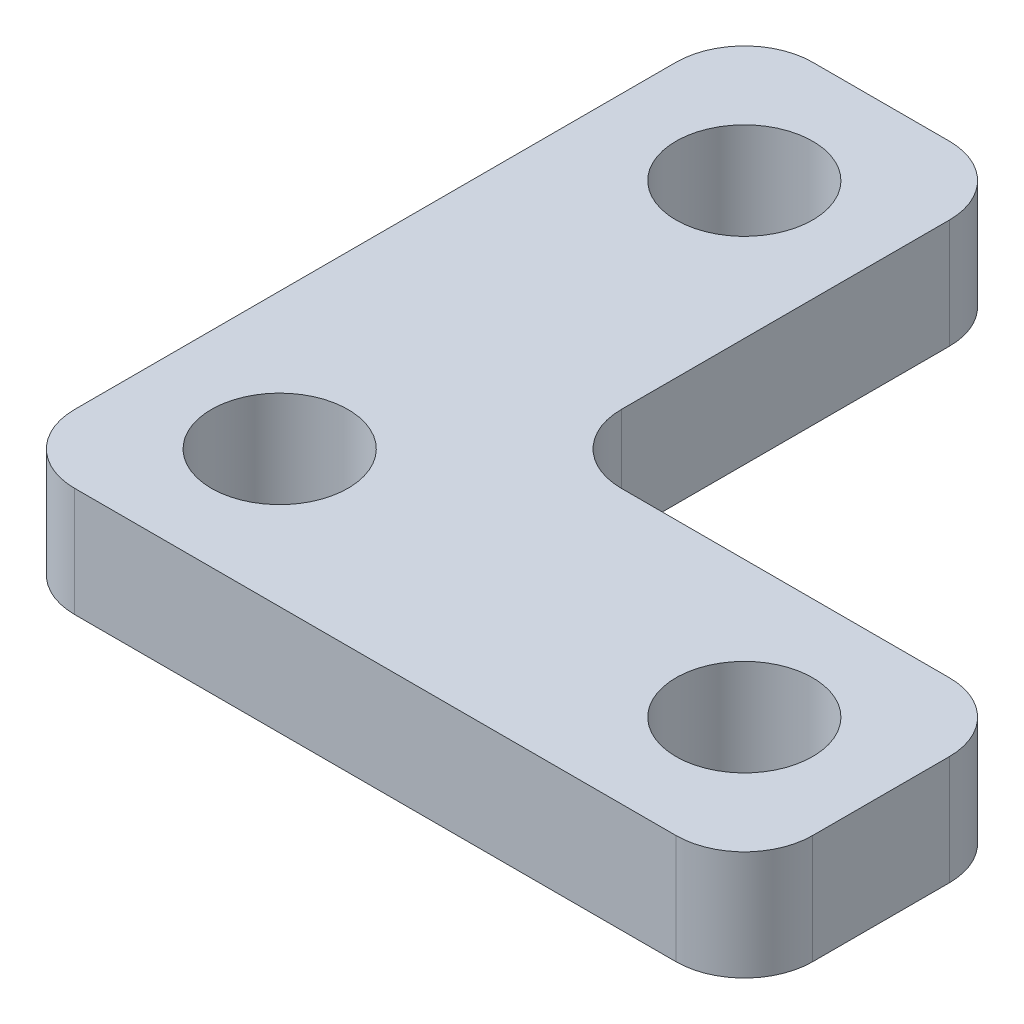
ISO-10303-21;
HEADER;
FILE_DESCRIPTION(('STEP AP214'),'2;1');
FILE_NAME('part.step','',(''),(''),'','','');
FILE_SCHEMA(('AUTOMOTIVE_DESIGN { 1 0 10303 214 1 1 1 1 }'));
ENDSEC;
DATA;
#1=APPLICATION_CONTEXT('core data for automotive mechanical design processes');
#2=APPLICATION_PROTOCOL_DEFINITION('international standard','automotive_design',2000,#1);
#3=PRODUCT_CONTEXT('',#1,'mechanical');
#4=PRODUCT('Part','Part','',(#3));
#5=PRODUCT_RELATED_PRODUCT_CATEGORY('part','',(#4));
#6=PRODUCT_DEFINITION_FORMATION('','',#4);
#7=PRODUCT_DEFINITION_CONTEXT('part definition',#1,'design');
#8=PRODUCT_DEFINITION('design','',#6,#7);
#9=PRODUCT_DEFINITION_SHAPE('','',#8);
#10=(LENGTH_UNIT() NAMED_UNIT(*) SI_UNIT(.MILLI.,.METRE.));
#11=(NAMED_UNIT(*) PLANE_ANGLE_UNIT() SI_UNIT($,.RADIAN.));
#12=(NAMED_UNIT(*) SI_UNIT($,.STERADIAN.) SOLID_ANGLE_UNIT());
#13=UNCERTAINTY_MEASURE_WITH_UNIT(LENGTH_MEASURE(1.E-05),#10,'distance_accuracy_value','');
#14=(GEOMETRIC_REPRESENTATION_CONTEXT(3) GLOBAL_UNCERTAINTY_ASSIGNED_CONTEXT((#13)) GLOBAL_UNIT_ASSIGNED_CONTEXT((#10,
#11,#12)) REPRESENTATION_CONTEXT('',''));
#15=CARTESIAN_POINT('',(0.,0.,0.));
#16=DIRECTION('',(0.,0.,1.));
#17=DIRECTION('',(1.,0.,0.));
#18=AXIS2_PLACEMENT_3D('',#15,#16,#17);
#19=CARTESIAN_POINT('',(12.5,4.,-12.5));
#20=DIRECTION('',(0.,1.,0.));
#21=DIRECTION('',(0.,0.,1.));
#22=AXIS2_PLACEMENT_3D('',#19,#20,#21);
#23=PLANE('',#22);
#24=CARTESIAN_POINT('',(5.,4.,-5.));
#25=DIRECTION('',(0.,1.,0.));
#26=DIRECTION('',(0.,0.,1.));
#27=AXIS2_PLACEMENT_3D('',#24,#25,#26);
#28=CIRCLE('',#27,2.5);
#29=CARTESIAN_POINT('',(5.,4.,-2.5));
#30=VERTEX_POINT('',#29);
#31=EDGE_CURVE('E292',#30,#30,#28,.T.);
#32=ORIENTED_EDGE('',*,*,#31,.F.);
#33=EDGE_LOOP('',(#32));
#34=FACE_BOUND('',#33,.T.);
#35=CARTESIAN_POINT('',(12.5,4.,-12.5));
#36=DIRECTION('',(0.,-1.,0.));
#37=DIRECTION('',(0.,0.,1.));
#38=AXIS2_PLACEMENT_3D('',#35,#36,#37);
#39=CIRCLE('',#38,2.5);
#40=CARTESIAN_POINT('',(12.5,4.,-10.));
#41=VERTEX_POINT('',#40);
#42=CARTESIAN_POINT('',(10.,4.,-12.5));
#43=VERTEX_POINT('',#42);
#44=EDGE_CURVE('E183',#41,#43,#39,.T.);
#45=ORIENTED_EDGE('',*,*,#44,.T.);
#46=DIRECTION('',(0.,0.,-1.));
#47=VECTOR('',#46,1.);
#48=CARTESIAN_POINT('',(10.,4.,-24.5));
#49=LINE('',#48,#47);
#50=CARTESIAN_POINT('',(10.,4.,-24.5));
#51=VERTEX_POINT('',#50);
#52=EDGE_CURVE('E111',#43,#51,#49,.T.);
#53=ORIENTED_EDGE('',*,*,#52,.T.);
#54=CARTESIAN_POINT('',(7.5,4.,-24.5));
#55=DIRECTION('',(0.,1.,0.));
#56=DIRECTION('',(0.,0.,-1.));
#57=AXIS2_PLACEMENT_3D('',#54,#55,#56);
#58=CIRCLE('',#57,2.5);
#59=CARTESIAN_POINT('',(7.49999999999998,4.,-27.));
#60=VERTEX_POINT('',#59);
#61=EDGE_CURVE('E210',#51,#60,#58,.T.);
#62=ORIENTED_EDGE('',*,*,#61,.T.);
#63=DIRECTION('',(-1.,0.,0.));
#64=VECTOR('',#63,1.);
#65=CARTESIAN_POINT('',(2.50000000000002,4.,-27.));
#66=LINE('',#65,#64);
#67=CARTESIAN_POINT('',(2.50000000000002,4.,-27.));
#68=VERTEX_POINT('',#67);
#69=EDGE_CURVE('E229',#60,#68,#66,.T.);
#70=ORIENTED_EDGE('',*,*,#69,.T.);
#71=CARTESIAN_POINT('',(2.5,4.,-24.5));
#72=DIRECTION('',(0.,1.,0.));
#73=DIRECTION('',(0.,0.,-1.));
#74=AXIS2_PLACEMENT_3D('',#71,#72,#73);
#75=CIRCLE('',#74,2.5);
#76=CARTESIAN_POINT('',(0.,4.,-24.5));
#77=VERTEX_POINT('',#76);
#78=EDGE_CURVE('E226',#68,#77,#75,.T.);
#79=ORIENTED_EDGE('',*,*,#78,.T.);
#80=DIRECTION('',(0.,0.,1.));
#81=VECTOR('',#80,1.);
#82=CARTESIAN_POINT('',(0.,4.,-2.50000000000002));
#83=LINE('',#82,#81);
#84=CARTESIAN_POINT('',(0.,4.,-2.50000000000002));
#85=VERTEX_POINT('',#84);
#86=EDGE_CURVE('E228',#77,#85,#83,.T.);
#87=ORIENTED_EDGE('',*,*,#86,.T.);
#88=CARTESIAN_POINT('',(2.5,4.,-2.5));
#89=DIRECTION('',(0.,1.,0.));
#90=DIRECTION('',(0.,0.,1.));
#91=AXIS2_PLACEMENT_3D('',#88,#89,#90);
#92=CIRCLE('',#91,2.5);
#93=CARTESIAN_POINT('',(2.5,4.,0.));
#94=VERTEX_POINT('',#93);
#95=EDGE_CURVE('E231',#85,#94,#92,.T.);
#96=ORIENTED_EDGE('',*,*,#95,.T.);
#97=DIRECTION('',(1.,0.,0.));
#98=VECTOR('',#97,1.);
#99=CARTESIAN_POINT('',(24.5,4.,0.));
#100=LINE('',#99,#98);
#101=CARTESIAN_POINT('',(24.5,4.,0.));
#102=VERTEX_POINT('',#101);
#103=EDGE_CURVE('E237',#94,#102,#100,.T.);
#104=ORIENTED_EDGE('',*,*,#103,.T.);
#105=CARTESIAN_POINT('',(24.5,4.,-2.5));
#106=DIRECTION('',(0.,1.,0.));
#107=DIRECTION('',(0.,0.,1.));
#108=AXIS2_PLACEMENT_3D('',#105,#106,#107);
#109=CIRCLE('',#108,2.5);
#110=CARTESIAN_POINT('',(27.,4.,-2.50000000000002));
#111=VERTEX_POINT('',#110);
#112=EDGE_CURVE('E142',#102,#111,#109,.T.);
#113=ORIENTED_EDGE('',*,*,#112,.T.);
#114=DIRECTION('',(0.,0.,-1.));
#115=VECTOR('',#114,1.);
#116=CARTESIAN_POINT('',(27.,4.,-7.49999999999998));
#117=LINE('',#116,#115);
#118=CARTESIAN_POINT('',(27.,4.,-7.49999999999998));
#119=VERTEX_POINT('',#118);
#120=EDGE_CURVE('E136',#111,#119,#117,.T.);
#121=ORIENTED_EDGE('',*,*,#120,.T.);
#122=CARTESIAN_POINT('',(24.5,4.,-7.5));
#123=DIRECTION('',(0.,1.,0.));
#124=DIRECTION('',(0.,0.,1.));
#125=AXIS2_PLACEMENT_3D('',#122,#123,#124);
#126=CIRCLE('',#125,2.5);
#127=CARTESIAN_POINT('',(24.5,4.,-10.));
#128=VERTEX_POINT('',#127);
#129=EDGE_CURVE('E140',#119,#128,#126,.T.);
#130=ORIENTED_EDGE('',*,*,#129,.T.);
#131=DIRECTION('',(-1.,0.,0.));
#132=VECTOR('',#131,1.);
#133=CARTESIAN_POINT('',(12.5,4.,-10.));
#134=LINE('',#133,#132);
#135=EDGE_CURVE('E56',#128,#41,#134,.T.);
#136=ORIENTED_EDGE('',*,*,#135,.T.);
#137=EDGE_LOOP('',(#45,#53,#62,#70,#79,#87,#96,#104,#113,#121,#130,#136));
#138=FACE_BOUND('',#137,.T.);
#139=CARTESIAN_POINT('',(22.,4.,-5.));
#140=DIRECTION('',(0.,1.,0.));
#141=DIRECTION('',(0.,0.,1.));
#142=AXIS2_PLACEMENT_3D('',#139,#140,#141);
#143=CIRCLE('',#142,2.5);
#144=CARTESIAN_POINT('',(22.,4.,-2.5));
#145=VERTEX_POINT('',#144);
#146=EDGE_CURVE('E164',#145,#145,#143,.T.);
#147=ORIENTED_EDGE('',*,*,#146,.F.);
#148=EDGE_LOOP('',(#147));
#149=FACE_BOUND('',#148,.T.);
#150=CARTESIAN_POINT('',(5.,4.,-22.));
#151=DIRECTION('',(0.,1.,0.));
#152=DIRECTION('',(0.,0.,1.));
#153=AXIS2_PLACEMENT_3D('',#150,#151,#152);
#154=CIRCLE('',#153,2.5);
#155=CARTESIAN_POINT('',(5.,4.,-19.5));
#156=VERTEX_POINT('',#155);
#157=EDGE_CURVE('E283',#156,#156,#154,.T.);
#158=ORIENTED_EDGE('',*,*,#157,.F.);
#159=EDGE_LOOP('',(#158));
#160=FACE_BOUND('',#159,.T.);
#161=ADVANCED_FACE('F39',(#34,#138,#149,#160),#23,.T.);
#162=CARTESIAN_POINT('',(12.5,0.,-12.5));
#163=DIRECTION('',(0.,1.,0.));
#164=DIRECTION('',(0.,0.,1.));
#165=AXIS2_PLACEMENT_3D('',#162,#163,#164);
#166=PLANE('',#165);
#167=CARTESIAN_POINT('',(12.5,0.,-12.5));
#168=DIRECTION('',(0.,-1.,0.));
#169=DIRECTION('',(0.,0.,1.));
#170=AXIS2_PLACEMENT_3D('',#167,#168,#169);
#171=CIRCLE('',#170,2.5);
#172=CARTESIAN_POINT('',(12.5,0.,-10.));
#173=VERTEX_POINT('',#172);
#174=CARTESIAN_POINT('',(10.,0.,-12.5));
#175=VERTEX_POINT('',#174);
#176=EDGE_CURVE('E160',#173,#175,#171,.T.);
#177=ORIENTED_EDGE('',*,*,#176,.F.);
#178=DIRECTION('',(-1.,0.,0.));
#179=VECTOR('',#178,1.);
#180=CARTESIAN_POINT('',(12.5,0.,-10.));
#181=LINE('',#180,#179);
#182=CARTESIAN_POINT('',(24.5,0.,-10.));
#183=VERTEX_POINT('',#182);
#184=EDGE_CURVE('E103',#183,#173,#181,.T.);
#185=ORIENTED_EDGE('',*,*,#184,.F.);
#186=CARTESIAN_POINT('',(24.5,0.,-7.5));
#187=DIRECTION('',(0.,1.,0.));
#188=DIRECTION('',(0.,0.,1.));
#189=AXIS2_PLACEMENT_3D('',#186,#187,#188);
#190=CIRCLE('',#189,2.5);
#191=CARTESIAN_POINT('',(27.,0.,-7.49999999999998));
#192=VERTEX_POINT('',#191);
#193=EDGE_CURVE('E97',#192,#183,#190,.T.);
#194=ORIENTED_EDGE('',*,*,#193,.F.);
#195=DIRECTION('',(0.,0.,-1.));
#196=VECTOR('',#195,1.);
#197=CARTESIAN_POINT('',(27.,0.,-7.49999999999998));
#198=LINE('',#197,#196);
#199=CARTESIAN_POINT('',(27.,0.,-2.50000000000002));
#200=VERTEX_POINT('',#199);
#201=EDGE_CURVE('E150',#200,#192,#198,.T.);
#202=ORIENTED_EDGE('',*,*,#201,.F.);
#203=CARTESIAN_POINT('',(24.5,0.,-2.5));
#204=DIRECTION('',(0.,1.,0.));
#205=DIRECTION('',(0.,0.,1.));
#206=AXIS2_PLACEMENT_3D('',#203,#204,#205);
#207=CIRCLE('',#206,2.5);
#208=CARTESIAN_POINT('',(24.5,0.,0.));
#209=VERTEX_POINT('',#208);
#210=EDGE_CURVE('E178',#209,#200,#207,.T.);
#211=ORIENTED_EDGE('',*,*,#210,.F.);
#212=DIRECTION('',(1.,0.,0.));
#213=VECTOR('',#212,1.);
#214=CARTESIAN_POINT('',(24.5,0.,0.));
#215=LINE('',#214,#213);
#216=CARTESIAN_POINT('',(2.5,0.,0.));
#217=VERTEX_POINT('',#216);
#218=EDGE_CURVE('E176',#217,#209,#215,.T.);
#219=ORIENTED_EDGE('',*,*,#218,.F.);
#220=CARTESIAN_POINT('',(2.5,0.,-2.5));
#221=DIRECTION('',(0.,1.,0.));
#222=DIRECTION('',(0.,0.,1.));
#223=AXIS2_PLACEMENT_3D('',#220,#221,#222);
#224=CIRCLE('',#223,2.5);
#225=CARTESIAN_POINT('',(0.,0.,-2.50000000000002));
#226=VERTEX_POINT('',#225);
#227=EDGE_CURVE('E174',#226,#217,#224,.T.);
#228=ORIENTED_EDGE('',*,*,#227,.F.);
#229=DIRECTION('',(0.,0.,1.));
#230=VECTOR('',#229,1.);
#231=CARTESIAN_POINT('',(0.,0.,-2.50000000000002));
#232=LINE('',#231,#230);
#233=CARTESIAN_POINT('',(0.,0.,-24.5));
#234=VERTEX_POINT('',#233);
#235=EDGE_CURVE('E172',#234,#226,#232,.T.);
#236=ORIENTED_EDGE('',*,*,#235,.F.);
#237=CARTESIAN_POINT('',(2.5,0.,-24.5));
#238=DIRECTION('',(0.,1.,0.));
#239=DIRECTION('',(0.,0.,-1.));
#240=AXIS2_PLACEMENT_3D('',#237,#238,#239);
#241=CIRCLE('',#240,2.5);
#242=CARTESIAN_POINT('',(2.50000000000002,0.,-27.));
#243=VERTEX_POINT('',#242);
#244=EDGE_CURVE('E170',#243,#234,#241,.T.);
#245=ORIENTED_EDGE('',*,*,#244,.F.);
#246=DIRECTION('',(-1.,0.,0.));
#247=VECTOR('',#246,1.);
#248=CARTESIAN_POINT('',(2.50000000000002,0.,-27.));
#249=LINE('',#248,#247);
#250=CARTESIAN_POINT('',(7.49999999999998,0.,-27.));
#251=VERTEX_POINT('',#250);
#252=EDGE_CURVE('E168',#251,#243,#249,.T.);
#253=ORIENTED_EDGE('',*,*,#252,.F.);
#254=CARTESIAN_POINT('',(7.5,0.,-24.5));
#255=DIRECTION('',(0.,1.,0.));
#256=DIRECTION('',(0.,0.,-1.));
#257=AXIS2_PLACEMENT_3D('',#254,#255,#256);
#258=CIRCLE('',#257,2.5);
#259=CARTESIAN_POINT('',(10.,0.,-24.5));
#260=VERTEX_POINT('',#259);
#261=EDGE_CURVE('E166',#260,#251,#258,.T.);
#262=ORIENTED_EDGE('',*,*,#261,.F.);
#263=DIRECTION('',(0.,0.,-1.));
#264=VECTOR('',#263,1.);
#265=CARTESIAN_POINT('',(10.,0.,-24.5));
#266=LINE('',#265,#264);
#267=EDGE_CURVE('E163',#175,#260,#266,.T.);
#268=ORIENTED_EDGE('',*,*,#267,.F.);
#269=EDGE_LOOP('',(#177,#185,#194,#202,#211,#219,#228,#236,#245,#253,#262,#268));
#270=FACE_BOUND('',#269,.T.);
#271=CARTESIAN_POINT('',(22.,0.,-5.));
#272=DIRECTION('',(0.,1.,0.));
#273=DIRECTION('',(0.,0.,1.));
#274=AXIS2_PLACEMENT_3D('',#271,#272,#273);
#275=CIRCLE('',#274,2.5);
#276=CARTESIAN_POINT('',(22.,0.,-2.5));
#277=VERTEX_POINT('',#276);
#278=EDGE_CURVE('E295',#277,#277,#275,.T.);
#279=ORIENTED_EDGE('',*,*,#278,.T.);
#280=EDGE_LOOP('',(#279));
#281=FACE_BOUND('',#280,.T.);
#282=CARTESIAN_POINT('',(5.,0.,-5.));
#283=DIRECTION('',(0.,1.,0.));
#284=DIRECTION('',(0.,0.,1.));
#285=AXIS2_PLACEMENT_3D('',#282,#283,#284);
#286=CIRCLE('',#285,2.5);
#287=CARTESIAN_POINT('',(5.,0.,-2.5));
#288=VERTEX_POINT('',#287);
#289=EDGE_CURVE('E289',#288,#288,#286,.T.);
#290=ORIENTED_EDGE('',*,*,#289,.T.);
#291=EDGE_LOOP('',(#290));
#292=FACE_BOUND('',#291,.T.);
#293=CARTESIAN_POINT('',(5.,0.,-22.));
#294=DIRECTION('',(0.,1.,0.));
#295=DIRECTION('',(0.,0.,1.));
#296=AXIS2_PLACEMENT_3D('',#293,#294,#295);
#297=CIRCLE('',#296,2.5);
#298=CARTESIAN_POINT('',(5.,0.,-19.5));
#299=VERTEX_POINT('',#298);
#300=EDGE_CURVE('E286',#299,#299,#297,.T.);
#301=ORIENTED_EDGE('',*,*,#300,.T.);
#302=EDGE_LOOP('',(#301));
#303=FACE_BOUND('',#302,.T.);
#304=ADVANCED_FACE('F214',(#270,#281,#292,#303),#166,.F.);
#305=CARTESIAN_POINT('',(12.5,4.,-12.5));
#306=DIRECTION('',(0.,-1.,0.));
#307=DIRECTION('',(0.,0.,-1.));
#308=AXIS2_PLACEMENT_3D('',#305,#306,#307);
#309=CYLINDRICAL_SURFACE('',#308,2.5);
#310=ORIENTED_EDGE('',*,*,#176,.T.);
#311=DIRECTION('',(0.,-1.,0.));
#312=VECTOR('',#311,1.);
#313=CARTESIAN_POINT('',(10.,4.,-12.5));
#314=LINE('',#313,#312);
#315=EDGE_CURVE('E11',#43,#175,#314,.T.);
#316=ORIENTED_EDGE('',*,*,#315,.F.);
#317=ORIENTED_EDGE('',*,*,#44,.F.);
#318=DIRECTION('',(0.,-1.,0.));
#319=VECTOR('',#318,1.);
#320=CARTESIAN_POINT('',(12.5,4.,-10.));
#321=LINE('',#320,#319);
#322=EDGE_CURVE('E156',#41,#173,#321,.T.);
#323=ORIENTED_EDGE('',*,*,#322,.T.);
#324=EDGE_LOOP('',(#310,#316,#317,#323));
#325=FACE_BOUND('',#324,.T.);
#326=ADVANCED_FACE('F41',(#325),#309,.F.);
#327=CARTESIAN_POINT('',(10.,4.,-24.5));
#328=DIRECTION('',(-1.,0.,0.));
#329=DIRECTION('',(0.,0.,1.));
#330=AXIS2_PLACEMENT_3D('',#327,#328,#329);
#331=PLANE('',#330);
#332=ORIENTED_EDGE('',*,*,#267,.T.);
#333=DIRECTION('',(0.,-1.,0.));
#334=VECTOR('',#333,1.);
#335=CARTESIAN_POINT('',(10.,4.,-24.5));
#336=LINE('',#335,#334);
#337=EDGE_CURVE('E48',#51,#260,#336,.T.);
#338=ORIENTED_EDGE('',*,*,#337,.F.);
#339=ORIENTED_EDGE('',*,*,#52,.F.);
#340=ORIENTED_EDGE('',*,*,#315,.T.);
#341=EDGE_LOOP('',(#332,#338,#339,#340));
#342=FACE_BOUND('',#341,.T.);
#343=ADVANCED_FACE('F407',(#342),#331,.F.);
#344=CARTESIAN_POINT('',(7.5,4.,-24.5));
#345=DIRECTION('',(0.,-1.,0.));
#346=DIRECTION('',(0.,0.,-1.));
#347=AXIS2_PLACEMENT_3D('',#344,#345,#346);
#348=CYLINDRICAL_SURFACE('',#347,2.5);
#349=ORIENTED_EDGE('',*,*,#261,.T.);
#350=DIRECTION('',(0.,-1.,0.));
#351=VECTOR('',#350,1.);
#352=CARTESIAN_POINT('',(7.49999999999998,4.,-27.));
#353=LINE('',#352,#351);
#354=EDGE_CURVE('E202',#60,#251,#353,.T.);
#355=ORIENTED_EDGE('',*,*,#354,.F.);
#356=ORIENTED_EDGE('',*,*,#61,.F.);
#357=ORIENTED_EDGE('',*,*,#337,.T.);
#358=EDGE_LOOP('',(#349,#355,#356,#357));
#359=FACE_BOUND('',#358,.T.);
#360=ADVANCED_FACE('F208',(#359),#348,.T.);
#361=CARTESIAN_POINT('',(2.50000000000002,4.,-27.));
#362=DIRECTION('',(0.,0.,1.));
#363=DIRECTION('',(1.,0.,0.));
#364=AXIS2_PLACEMENT_3D('',#361,#362,#363);
#365=PLANE('',#364);
#366=ORIENTED_EDGE('',*,*,#252,.T.);
#367=DIRECTION('',(0.,-1.,0.));
#368=VECTOR('',#367,1.);
#369=CARTESIAN_POINT('',(2.50000000000002,4.,-27.));
#370=LINE('',#369,#368);
#371=EDGE_CURVE('E199',#68,#243,#370,.T.);
#372=ORIENTED_EDGE('',*,*,#371,.F.);
#373=ORIENTED_EDGE('',*,*,#69,.F.);
#374=ORIENTED_EDGE('',*,*,#354,.T.);
#375=EDGE_LOOP('',(#366,#372,#373,#374));
#376=FACE_BOUND('',#375,.T.);
#377=ADVANCED_FACE('F220',(#376),#365,.F.);
#378=CARTESIAN_POINT('',(2.5,4.,-24.5));
#379=DIRECTION('',(0.,-1.,0.));
#380=DIRECTION('',(0.,0.,-1.));
#381=AXIS2_PLACEMENT_3D('',#378,#379,#380);
#382=CYLINDRICAL_SURFACE('',#381,2.5);
#383=ORIENTED_EDGE('',*,*,#244,.T.);
#384=DIRECTION('',(0.,-1.,0.));
#385=VECTOR('',#384,1.);
#386=CARTESIAN_POINT('',(0.,4.,-24.5));
#387=LINE('',#386,#385);
#388=EDGE_CURVE('E196',#77,#234,#387,.T.);
#389=ORIENTED_EDGE('',*,*,#388,.F.);
#390=ORIENTED_EDGE('',*,*,#78,.F.);
#391=ORIENTED_EDGE('',*,*,#371,.T.);
#392=EDGE_LOOP('',(#383,#389,#390,#391));
#393=FACE_BOUND('',#392,.T.);
#394=ADVANCED_FACE('F224',(#393),#382,.T.);
#395=CARTESIAN_POINT('',(0.,4.,-2.50000000000002));
#396=DIRECTION('',(1.,0.,0.));
#397=DIRECTION('',(0.,0.,-1.));
#398=AXIS2_PLACEMENT_3D('',#395,#396,#397);
#399=PLANE('',#398);
#400=ORIENTED_EDGE('',*,*,#235,.T.);
#401=DIRECTION('',(0.,-1.,0.));
#402=VECTOR('',#401,1.);
#403=CARTESIAN_POINT('',(0.,4.,-2.50000000000002));
#404=LINE('',#403,#402);
#405=EDGE_CURVE('E193',#85,#226,#404,.T.);
#406=ORIENTED_EDGE('',*,*,#405,.F.);
#407=ORIENTED_EDGE('',*,*,#86,.F.);
#408=ORIENTED_EDGE('',*,*,#388,.T.);
#409=EDGE_LOOP('',(#400,#406,#407,#408));
#410=FACE_BOUND('',#409,.T.);
#411=ADVANCED_FACE('F368',(#410),#399,.F.);
#412=CARTESIAN_POINT('',(2.5,4.,-2.5));
#413=DIRECTION('',(0.,-1.,0.));
#414=DIRECTION('',(0.,0.,-1.));
#415=AXIS2_PLACEMENT_3D('',#412,#413,#414);
#416=CYLINDRICAL_SURFACE('',#415,2.5);
#417=ORIENTED_EDGE('',*,*,#227,.T.);
#418=DIRECTION('',(0.,-1.,0.));
#419=VECTOR('',#418,1.);
#420=CARTESIAN_POINT('',(2.5,4.,0.));
#421=LINE('',#420,#419);
#422=EDGE_CURVE('E190',#94,#217,#421,.T.);
#423=ORIENTED_EDGE('',*,*,#422,.F.);
#424=ORIENTED_EDGE('',*,*,#95,.F.);
#425=ORIENTED_EDGE('',*,*,#405,.T.);
#426=EDGE_LOOP('',(#417,#423,#424,#425));
#427=FACE_BOUND('',#426,.T.);
#428=ADVANCED_FACE('F358',(#427),#416,.T.);
#429=CARTESIAN_POINT('',(24.5,4.,0.));
#430=DIRECTION('',(0.,0.,-1.));
#431=DIRECTION('',(-1.,0.,0.));
#432=AXIS2_PLACEMENT_3D('',#429,#430,#431);
#433=PLANE('',#432);
#434=ORIENTED_EDGE('',*,*,#218,.T.);
#435=DIRECTION('',(0.,-1.,0.));
#436=VECTOR('',#435,1.);
#437=CARTESIAN_POINT('',(24.5,4.,0.));
#438=LINE('',#437,#436);
#439=EDGE_CURVE('E187',#102,#209,#438,.T.);
#440=ORIENTED_EDGE('',*,*,#439,.F.);
#441=ORIENTED_EDGE('',*,*,#103,.F.);
#442=ORIENTED_EDGE('',*,*,#422,.T.);
#443=EDGE_LOOP('',(#434,#440,#441,#442));
#444=FACE_BOUND('',#443,.T.);
#445=ADVANCED_FACE('F243',(#444),#433,.F.);
#446=CARTESIAN_POINT('',(24.5,4.,-2.5));
#447=DIRECTION('',(0.,-1.,0.));
#448=DIRECTION('',(0.,0.,-1.));
#449=AXIS2_PLACEMENT_3D('',#446,#447,#448);
#450=CYLINDRICAL_SURFACE('',#449,2.5);
#451=ORIENTED_EDGE('',*,*,#210,.T.);
#452=DIRECTION('',(0.,-1.,0.));
#453=VECTOR('',#452,1.);
#454=CARTESIAN_POINT('',(27.,4.,-2.50000000000002));
#455=LINE('',#454,#453);
#456=EDGE_CURVE('E151',#111,#200,#455,.T.);
#457=ORIENTED_EDGE('',*,*,#456,.F.);
#458=ORIENTED_EDGE('',*,*,#112,.F.);
#459=ORIENTED_EDGE('',*,*,#439,.T.);
#460=EDGE_LOOP('',(#451,#457,#458,#459));
#461=FACE_BOUND('',#460,.T.);
#462=ADVANCED_FACE('F247',(#461),#450,.T.);
#463=CARTESIAN_POINT('',(27.,4.,-7.49999999999998));
#464=DIRECTION('',(-1.,0.,0.));
#465=DIRECTION('',(0.,0.,1.));
#466=AXIS2_PLACEMENT_3D('',#463,#464,#465);
#467=PLANE('',#466);
#468=ORIENTED_EDGE('',*,*,#201,.T.);
#469=DIRECTION('',(0.,-1.,0.));
#470=VECTOR('',#469,1.);
#471=CARTESIAN_POINT('',(27.,4.,-7.49999999999998));
#472=LINE('',#471,#470);
#473=EDGE_CURVE('E147',#119,#192,#472,.T.);
#474=ORIENTED_EDGE('',*,*,#473,.F.);
#475=ORIENTED_EDGE('',*,*,#120,.F.);
#476=ORIENTED_EDGE('',*,*,#456,.T.);
#477=EDGE_LOOP('',(#468,#474,#475,#476));
#478=FACE_BOUND('',#477,.T.);
#479=ADVANCED_FACE('F148',(#478),#467,.F.);
#480=CARTESIAN_POINT('',(24.5,4.,-7.5));
#481=DIRECTION('',(0.,-1.,0.));
#482=DIRECTION('',(0.,0.,-1.));
#483=AXIS2_PLACEMENT_3D('',#480,#481,#482);
#484=CYLINDRICAL_SURFACE('',#483,2.5);
#485=ORIENTED_EDGE('',*,*,#193,.T.);
#486=DIRECTION('',(0.,-1.,0.));
#487=VECTOR('',#486,1.);
#488=CARTESIAN_POINT('',(24.5,4.,-10.));
#489=LINE('',#488,#487);
#490=EDGE_CURVE('E152',#128,#183,#489,.T.);
#491=ORIENTED_EDGE('',*,*,#490,.F.);
#492=ORIENTED_EDGE('',*,*,#129,.F.);
#493=ORIENTED_EDGE('',*,*,#473,.T.);
#494=EDGE_LOOP('',(#485,#491,#492,#493));
#495=FACE_BOUND('',#494,.T.);
#496=ADVANCED_FACE('F154',(#495),#484,.T.);
#497=CARTESIAN_POINT('',(12.5,4.,-10.));
#498=DIRECTION('',(0.,0.,1.));
#499=DIRECTION('',(1.,0.,0.));
#500=AXIS2_PLACEMENT_3D('',#497,#498,#499);
#501=PLANE('',#500);
#502=ORIENTED_EDGE('',*,*,#184,.T.);
#503=ORIENTED_EDGE('',*,*,#322,.F.);
#504=ORIENTED_EDGE('',*,*,#135,.F.);
#505=ORIENTED_EDGE('',*,*,#490,.T.);
#506=EDGE_LOOP('',(#502,#503,#504,#505));
#507=FACE_BOUND('',#506,.T.);
#508=ADVANCED_FACE('F251',(#507),#501,.F.);
#509=CARTESIAN_POINT('',(22.,4.,-5.));
#510=DIRECTION('',(0.,-1.,0.));
#511=DIRECTION('',(0.,0.,-1.));
#512=AXIS2_PLACEMENT_3D('',#509,#510,#511);
#513=CYLINDRICAL_SURFACE('',#512,2.5);
#514=ORIENTED_EDGE('',*,*,#146,.T.);
#515=EDGE_LOOP('',(#514));
#516=FACE_BOUND('',#515,.T.);
#517=ORIENTED_EDGE('',*,*,#278,.F.);
#518=EDGE_LOOP('',(#517));
#519=FACE_BOUND('',#518,.T.);
#520=ADVANCED_FACE('F253',(#516,#519),#513,.F.);
#521=CARTESIAN_POINT('',(5.,4.,-5.));
#522=DIRECTION('',(0.,-1.,0.));
#523=DIRECTION('',(0.,0.,-1.));
#524=AXIS2_PLACEMENT_3D('',#521,#522,#523);
#525=CYLINDRICAL_SURFACE('',#524,2.5);
#526=ORIENTED_EDGE('',*,*,#31,.T.);
#527=EDGE_LOOP('',(#526));
#528=FACE_BOUND('',#527,.T.);
#529=ORIENTED_EDGE('',*,*,#289,.F.);
#530=EDGE_LOOP('',(#529));
#531=FACE_BOUND('',#530,.T.);
#532=ADVANCED_FACE('F259',(#528,#531),#525,.F.);
#533=CARTESIAN_POINT('',(5.,4.,-22.));
#534=DIRECTION('',(0.,-1.,0.));
#535=DIRECTION('',(0.,0.,-1.));
#536=AXIS2_PLACEMENT_3D('',#533,#534,#535);
#537=CYLINDRICAL_SURFACE('',#536,2.5);
#538=ORIENTED_EDGE('',*,*,#157,.T.);
#539=EDGE_LOOP('',(#538));
#540=FACE_BOUND('',#539,.T.);
#541=ORIENTED_EDGE('',*,*,#300,.F.);
#542=EDGE_LOOP('',(#541));
#543=FACE_BOUND('',#542,.T.);
#544=ADVANCED_FACE('F274',(#540,#543),#537,.F.);
#545=CLOSED_SHELL('',(#161,#304,#326,#343,#360,#377,#394,#411,#428,#445,#462,#479,#496,#508,
#520,#532,#544));
#546=MANIFOLD_SOLID_BREP('B2',#545);
#547=ADVANCED_BREP_SHAPE_REPRESENTATION('',(#18,#546),#14);
#548=SHAPE_DEFINITION_REPRESENTATION(#9,#547);
ENDSEC;
END-ISO-10303-21;
